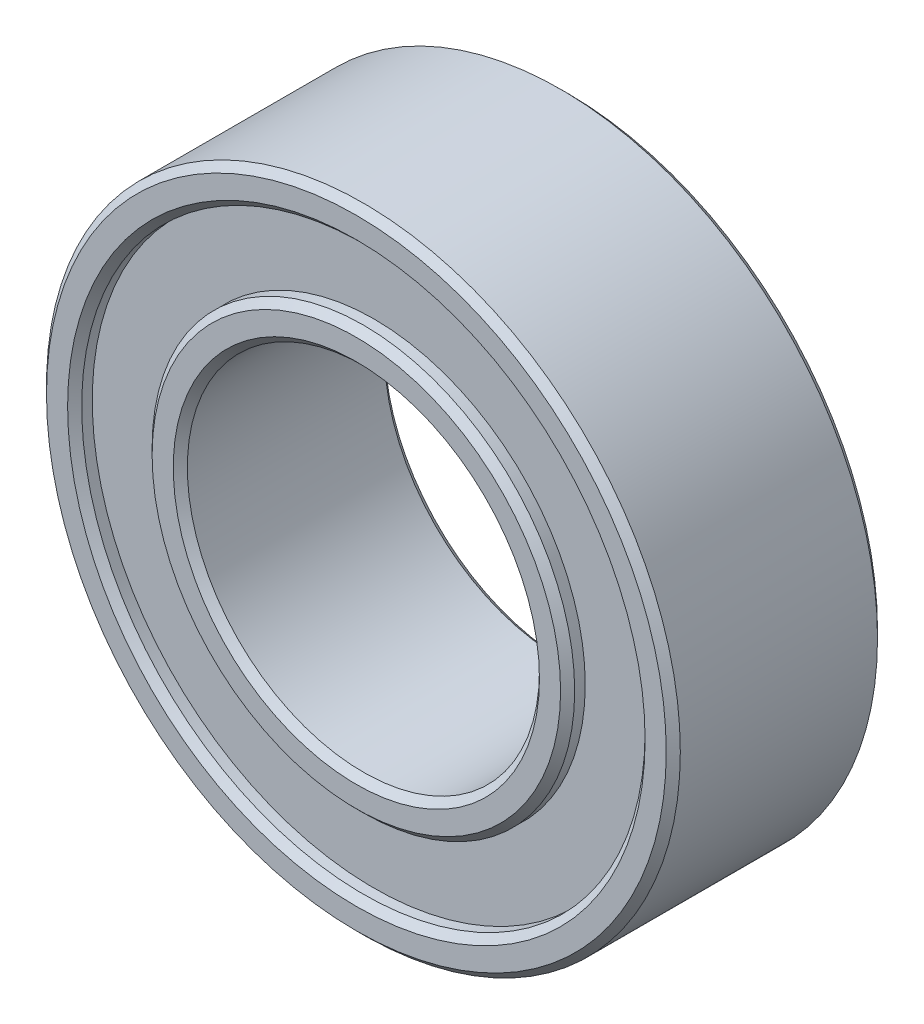
ISO-10303-21;
HEADER;
FILE_DESCRIPTION(('STEP AP214'),'2;1');
FILE_NAME('part.step','',(''),(''),'','','');
FILE_SCHEMA(('AUTOMOTIVE_DESIGN { 1 0 10303 214 1 1 1 1 }'));
ENDSEC;
DATA;
#1=APPLICATION_CONTEXT('core data for automotive mechanical design processes');
#2=APPLICATION_PROTOCOL_DEFINITION('international standard','automotive_design',2000,#1);
#3=PRODUCT_CONTEXT('',#1,'mechanical');
#4=PRODUCT('Part','Part','',(#3));
#5=PRODUCT_RELATED_PRODUCT_CATEGORY('part','',(#4));
#6=PRODUCT_DEFINITION_FORMATION('','',#4);
#7=PRODUCT_DEFINITION_CONTEXT('part definition',#1,'design');
#8=PRODUCT_DEFINITION('design','',#6,#7);
#9=PRODUCT_DEFINITION_SHAPE('','',#8);
#10=(LENGTH_UNIT() NAMED_UNIT(*) SI_UNIT(.MILLI.,.METRE.));
#11=(NAMED_UNIT(*) PLANE_ANGLE_UNIT() SI_UNIT($,.RADIAN.));
#12=(NAMED_UNIT(*) SI_UNIT($,.STERADIAN.) SOLID_ANGLE_UNIT());
#13=UNCERTAINTY_MEASURE_WITH_UNIT(LENGTH_MEASURE(1.E-05),#10,'distance_accuracy_value','');
#14=(GEOMETRIC_REPRESENTATION_CONTEXT(3) GLOBAL_UNCERTAINTY_ASSIGNED_CONTEXT((#13)) GLOBAL_UNIT_ASSIGNED_CONTEXT((#10,
#11,#12)) REPRESENTATION_CONTEXT('',''));
#15=CARTESIAN_POINT('',(0.,0.,0.));
#16=DIRECTION('',(0.,0.,1.));
#17=DIRECTION('',(1.,0.,0.));
#18=AXIS2_PLACEMENT_3D('',#15,#16,#17);
#19=CARTESIAN_POINT('',(0.,0.,0.100000000000003));
#20=DIRECTION('',(0.,0.,-1.));
#21=DIRECTION('',(-1.,0.,0.));
#22=AXIS2_PLACEMENT_3D('',#19,#20,#21);
#23=CONICAL_SURFACE('',#22,4.,0.785398163397457);
#24=CARTESIAN_POINT('',(0.,0.,0.100000000000003));
#25=DIRECTION('',(0.,0.,-1.));
#26=DIRECTION('',(-1.,0.,0.));
#27=AXIS2_PLACEMENT_3D('',#24,#25,#26);
#28=CIRCLE('',#27,4.);
#29=CARTESIAN_POINT('',(-4.,0.,0.100000000000003));
#30=VERTEX_POINT('',#29);
#31=EDGE_CURVE('E18',#30,#30,#28,.T.);
#32=ORIENTED_EDGE('',*,*,#31,.F.);
#33=EDGE_LOOP('',(#32));
#34=FACE_BOUND('',#33,.T.);
#35=CARTESIAN_POINT('',(0.,0.,0.));
#36=DIRECTION('',(0.,0.,1.));
#37=DIRECTION('',(1.,0.,0.));
#38=AXIS2_PLACEMENT_3D('',#35,#36,#37);
#39=CIRCLE('',#38,4.1);
#40=CARTESIAN_POINT('',(4.1,0.,0.));
#41=VERTEX_POINT('',#40);
#42=EDGE_CURVE('E48',#41,#41,#39,.T.);
#43=ORIENTED_EDGE('',*,*,#42,.F.);
#44=EDGE_LOOP('',(#43));
#45=FACE_BOUND('',#44,.T.);
#46=ADVANCED_FACE('F15',(#34,#45),#23,.F.);
#47=CARTESIAN_POINT('',(0.,0.,0.));
#48=DIRECTION('',(0.,0.,1.));
#49=DIRECTION('',(1.,0.,0.));
#50=AXIS2_PLACEMENT_3D('',#47,#48,#49);
#51=CONICAL_SURFACE('',#50,2.9,0.785398163397453);
#52=CARTESIAN_POINT('',(0.,0.,0.1));
#53=DIRECTION('',(0.,0.,1.));
#54=DIRECTION('',(1.,0.,0.));
#55=AXIS2_PLACEMENT_3D('',#52,#53,#54);
#56=CIRCLE('',#55,3.);
#57=CARTESIAN_POINT('',(3.,0.,0.1));
#58=VERTEX_POINT('',#57);
#59=EDGE_CURVE('E10',#58,#58,#56,.T.);
#60=ORIENTED_EDGE('',*,*,#59,.F.);
#61=EDGE_LOOP('',(#60));
#62=FACE_BOUND('',#61,.T.);
#63=CARTESIAN_POINT('',(0.,0.,0.));
#64=DIRECTION('',(0.,0.,-1.));
#65=DIRECTION('',(1.,0.,0.));
#66=AXIS2_PLACEMENT_3D('',#63,#64,#65);
#67=CIRCLE('',#66,2.9);
#68=CARTESIAN_POINT('',(2.9,0.,0.));
#69=VERTEX_POINT('',#68);
#70=EDGE_CURVE('E67',#69,#69,#67,.T.);
#71=ORIENTED_EDGE('',*,*,#70,.F.);
#72=EDGE_LOOP('',(#71));
#73=FACE_BOUND('',#72,.T.);
#74=ADVANCED_FACE('F134',(#62,#73),#51,.T.);
#75=CARTESIAN_POINT('',(0.,0.,0.));
#76=DIRECTION('',(0.,0.,-1.));
#77=DIRECTION('',(-1.,0.,0.));
#78=AXIS2_PLACEMENT_3D('',#75,#76,#77);
#79=CONICAL_SURFACE('',#78,2.6,0.785398163397451);
#80=CARTESIAN_POINT('',(0.,0.,0.1));
#81=DIRECTION('',(0.,0.,-1.));
#82=DIRECTION('',(1.,0.,0.));
#83=AXIS2_PLACEMENT_3D('',#80,#81,#82);
#84=CIRCLE('',#83,2.5);
#85=CARTESIAN_POINT('',(2.5,0.,0.1));
#86=VERTEX_POINT('',#85);
#87=EDGE_CURVE('E79',#86,#86,#84,.T.);
#88=ORIENTED_EDGE('',*,*,#87,.F.);
#89=EDGE_LOOP('',(#88));
#90=FACE_BOUND('',#89,.T.);
#91=CARTESIAN_POINT('',(0.,0.,0.));
#92=DIRECTION('',(0.,0.,1.));
#93=DIRECTION('',(1.,0.,0.));
#94=AXIS2_PLACEMENT_3D('',#91,#92,#93);
#95=CIRCLE('',#94,2.6);
#96=CARTESIAN_POINT('',(2.6,0.,0.));
#97=VERTEX_POINT('',#96);
#98=EDGE_CURVE('E65',#97,#97,#95,.T.);
#99=ORIENTED_EDGE('',*,*,#98,.F.);
#100=EDGE_LOOP('',(#99));
#101=FACE_BOUND('',#100,.T.);
#102=ADVANCED_FACE('F139',(#90,#101),#79,.F.);
#103=CARTESIAN_POINT('',(0.,0.,0.0999999999999985));
#104=DIRECTION('',(0.,0.,1.));
#105=DIRECTION('',(1.,0.,0.));
#106=AXIS2_PLACEMENT_3D('',#103,#104,#105);
#107=CONICAL_SURFACE('',#106,4.5,0.785398163397453);
#108=CARTESIAN_POINT('',(0.,0.,0.0999999999999985));
#109=DIRECTION('',(0.,0.,1.));
#110=DIRECTION('',(1.,0.,0.));
#111=AXIS2_PLACEMENT_3D('',#108,#109,#110);
#112=CIRCLE('',#111,4.5);
#113=CARTESIAN_POINT('',(4.5,0.,0.0999999999999985));
#114=VERTEX_POINT('',#113);
#115=EDGE_CURVE('E80',#114,#114,#112,.T.);
#116=ORIENTED_EDGE('',*,*,#115,.F.);
#117=EDGE_LOOP('',(#116));
#118=FACE_BOUND('',#117,.T.);
#119=CARTESIAN_POINT('',(0.,0.,0.));
#120=DIRECTION('',(0.,0.,-1.));
#121=DIRECTION('',(1.,0.,0.));
#122=AXIS2_PLACEMENT_3D('',#119,#120,#121);
#123=CIRCLE('',#122,4.4);
#124=CARTESIAN_POINT('',(4.4,0.,0.));
#125=VERTEX_POINT('',#124);
#126=EDGE_CURVE('E52',#125,#125,#123,.T.);
#127=ORIENTED_EDGE('',*,*,#126,.F.);
#128=EDGE_LOOP('',(#127));
#129=FACE_BOUND('',#128,.T.);
#130=ADVANCED_FACE('F111',(#118,#129),#107,.T.);
#131=CARTESIAN_POINT('',(0.,0.,2.9));
#132=DIRECTION('',(0.,0.,1.));
#133=DIRECTION('',(1.,0.,0.));
#134=AXIS2_PLACEMENT_3D('',#131,#132,#133);
#135=CONICAL_SURFACE('',#134,4.,0.785398163397461);
#136=CARTESIAN_POINT('',(0.,0.,2.9));
#137=DIRECTION('',(0.,0.,1.));
#138=DIRECTION('',(1.,0.,0.));
#139=AXIS2_PLACEMENT_3D('',#136,#137,#138);
#140=CIRCLE('',#139,4.);
#141=CARTESIAN_POINT('',(4.,0.,2.9));
#142=VERTEX_POINT('',#141);
#143=EDGE_CURVE('E90',#142,#142,#140,.T.);
#144=ORIENTED_EDGE('',*,*,#143,.F.);
#145=EDGE_LOOP('',(#144));
#146=FACE_BOUND('',#145,.T.);
#147=CARTESIAN_POINT('',(0.,0.,3.));
#148=DIRECTION('',(0.,0.,-1.));
#149=DIRECTION('',(1.,0.,0.));
#150=AXIS2_PLACEMENT_3D('',#147,#148,#149);
#151=CIRCLE('',#150,4.1);
#152=CARTESIAN_POINT('',(4.1,0.,3.));
#153=VERTEX_POINT('',#152);
#154=EDGE_CURVE('E56',#153,#153,#151,.T.);
#155=ORIENTED_EDGE('',*,*,#154,.F.);
#156=EDGE_LOOP('',(#155));
#157=FACE_BOUND('',#156,.T.);
#158=ADVANCED_FACE('F107',(#146,#157),#135,.F.);
#159=CARTESIAN_POINT('',(0.,0.,3.));
#160=DIRECTION('',(0.,0.,-1.));
#161=DIRECTION('',(-1.,0.,0.));
#162=AXIS2_PLACEMENT_3D('',#159,#160,#161);
#163=CONICAL_SURFACE('',#162,4.4,0.785398163397448);
#164=CARTESIAN_POINT('',(0.,0.,2.9));
#165=DIRECTION('',(0.,0.,-1.));
#166=DIRECTION('',(1.,0.,0.));
#167=AXIS2_PLACEMENT_3D('',#164,#165,#166);
#168=CIRCLE('',#167,4.5);
#169=CARTESIAN_POINT('',(4.5,0.,2.9));
#170=VERTEX_POINT('',#169);
#171=EDGE_CURVE('E71',#170,#170,#168,.T.);
#172=ORIENTED_EDGE('',*,*,#171,.F.);
#173=EDGE_LOOP('',(#172));
#174=FACE_BOUND('',#173,.T.);
#175=CARTESIAN_POINT('',(0.,0.,3.));
#176=DIRECTION('',(0.,0.,1.));
#177=DIRECTION('',(1.,0.,0.));
#178=AXIS2_PLACEMENT_3D('',#175,#176,#177);
#179=CIRCLE('',#178,4.4);
#180=CARTESIAN_POINT('',(4.4,0.,3.));
#181=VERTEX_POINT('',#180);
#182=EDGE_CURVE('E60',#181,#181,#179,.T.);
#183=ORIENTED_EDGE('',*,*,#182,.F.);
#184=EDGE_LOOP('',(#183));
#185=FACE_BOUND('',#184,.T.);
#186=ADVANCED_FACE('F110',(#174,#185),#163,.T.);
#187=CARTESIAN_POINT('',(0.,0.,3.));
#188=DIRECTION('',(0.,0.,-1.));
#189=DIRECTION('',(-1.,0.,0.));
#190=AXIS2_PLACEMENT_3D('',#187,#188,#189);
#191=CONICAL_SURFACE('',#190,2.9,0.785398163397453);
#192=CARTESIAN_POINT('',(0.,0.,2.9));
#193=DIRECTION('',(0.,0.,-1.));
#194=DIRECTION('',(1.,0.,0.));
#195=AXIS2_PLACEMENT_3D('',#192,#193,#194);
#196=CIRCLE('',#195,3.);
#197=CARTESIAN_POINT('',(3.,0.,2.9));
#198=VERTEX_POINT('',#197);
#199=EDGE_CURVE('E32',#198,#198,#196,.T.);
#200=ORIENTED_EDGE('',*,*,#199,.F.);
#201=EDGE_LOOP('',(#200));
#202=FACE_BOUND('',#201,.T.);
#203=CARTESIAN_POINT('',(0.,0.,3.));
#204=DIRECTION('',(0.,0.,1.));
#205=DIRECTION('',(1.,0.,0.));
#206=AXIS2_PLACEMENT_3D('',#203,#204,#205);
#207=CIRCLE('',#206,2.9);
#208=CARTESIAN_POINT('',(2.9,0.,3.));
#209=VERTEX_POINT('',#208);
#210=EDGE_CURVE('E61',#209,#209,#207,.T.);
#211=ORIENTED_EDGE('',*,*,#210,.F.);
#212=EDGE_LOOP('',(#211));
#213=FACE_BOUND('',#212,.T.);
#214=ADVANCED_FACE('F303',(#202,#213),#191,.T.);
#215=CARTESIAN_POINT('',(0.,0.,2.9));
#216=DIRECTION('',(0.,0.,1.));
#217=DIRECTION('',(1.,0.,0.));
#218=AXIS2_PLACEMENT_3D('',#215,#216,#217);
#219=CONICAL_SURFACE('',#218,2.5,0.785398163397451);
#220=CARTESIAN_POINT('',(0.,0.,2.9));
#221=DIRECTION('',(0.,0.,1.));
#222=DIRECTION('',(1.,0.,0.));
#223=AXIS2_PLACEMENT_3D('',#220,#221,#222);
#224=CIRCLE('',#223,2.5);
#225=CARTESIAN_POINT('',(2.5,0.,2.9));
#226=VERTEX_POINT('',#225);
#227=EDGE_CURVE('E75',#226,#226,#224,.T.);
#228=ORIENTED_EDGE('',*,*,#227,.F.);
#229=EDGE_LOOP('',(#228));
#230=FACE_BOUND('',#229,.T.);
#231=CARTESIAN_POINT('',(0.,0.,3.));
#232=DIRECTION('',(0.,0.,-1.));
#233=DIRECTION('',(1.,0.,0.));
#234=AXIS2_PLACEMENT_3D('',#231,#232,#233);
#235=CIRCLE('',#234,2.6);
#236=CARTESIAN_POINT('',(2.6,0.,3.));
#237=VERTEX_POINT('',#236);
#238=EDGE_CURVE('E66',#237,#237,#235,.T.);
#239=ORIENTED_EDGE('',*,*,#238,.F.);
#240=EDGE_LOOP('',(#239));
#241=FACE_BOUND('',#240,.T.);
#242=ADVANCED_FACE('F158',(#230,#241),#219,.F.);
#243=CARTESIAN_POINT('',(0.,0.,2.75));
#244=DIRECTION('',(0.,0.,1.));
#245=DIRECTION('',(1.,0.,0.));
#246=AXIS2_PLACEMENT_3D('',#243,#244,#245);
#247=CYLINDRICAL_SURFACE('',#246,3.);
#248=ORIENTED_EDGE('',*,*,#59,.T.);
#249=EDGE_LOOP('',(#248));
#250=FACE_BOUND('',#249,.T.);
#251=CARTESIAN_POINT('',(0.,0.,0.25));
#252=DIRECTION('',(0.,0.,-1.));
#253=DIRECTION('',(-1.,0.,0.));
#254=AXIS2_PLACEMENT_3D('',#251,#252,#253);
#255=CIRCLE('',#254,3.);
#256=CARTESIAN_POINT('',(-3.,0.,0.25));
#257=VERTEX_POINT('',#256);
#258=EDGE_CURVE('E35',#257,#257,#255,.T.);
#259=ORIENTED_EDGE('',*,*,#258,.T.);
#260=EDGE_LOOP('',(#259));
#261=FACE_BOUND('',#260,.T.);
#262=ADVANCED_FACE('F149',(#250,#261),#247,.T.);
#263=CARTESIAN_POINT('',(0.,0.,2.75));
#264=DIRECTION('',(0.,0.,1.));
#265=DIRECTION('',(1.,0.,0.));
#266=AXIS2_PLACEMENT_3D('',#263,#264,#265);
#267=CYLINDRICAL_SURFACE('',#266,4.);
#268=CARTESIAN_POINT('',(0.,0.,0.25));
#269=DIRECTION('',(0.,0.,-1.));
#270=DIRECTION('',(-1.,0.,0.));
#271=AXIS2_PLACEMENT_3D('',#268,#269,#270);
#272=CIRCLE('',#271,4.);
#273=CARTESIAN_POINT('',(-4.,0.,0.25));
#274=VERTEX_POINT('',#273);
#275=EDGE_CURVE('E36',#274,#274,#272,.T.);
#276=ORIENTED_EDGE('',*,*,#275,.F.);
#277=EDGE_LOOP('',(#276));
#278=FACE_BOUND('',#277,.T.);
#279=ORIENTED_EDGE('',*,*,#31,.T.);
#280=EDGE_LOOP('',(#279));
#281=FACE_BOUND('',#280,.T.);
#282=ADVANCED_FACE('F146',(#278,#281),#267,.F.);
#283=CARTESIAN_POINT('',(0.,0.,2.75));
#284=DIRECTION('',(0.,0.,1.));
#285=DIRECTION('',(1.,0.,0.));
#286=AXIS2_PLACEMENT_3D('',#283,#284,#285);
#287=CYLINDRICAL_SURFACE('',#286,3.);
#288=ORIENTED_EDGE('',*,*,#199,.T.);
#289=EDGE_LOOP('',(#288));
#290=FACE_BOUND('',#289,.T.);
#291=CARTESIAN_POINT('',(0.,0.,2.75));
#292=DIRECTION('',(0.,0.,1.));
#293=DIRECTION('',(1.,0.,0.));
#294=AXIS2_PLACEMENT_3D('',#291,#292,#293);
#295=CIRCLE('',#294,3.);
#296=CARTESIAN_POINT('',(3.,0.,2.75));
#297=VERTEX_POINT('',#296);
#298=EDGE_CURVE('E40',#297,#297,#295,.T.);
#299=ORIENTED_EDGE('',*,*,#298,.T.);
#300=EDGE_LOOP('',(#299));
#301=FACE_BOUND('',#300,.T.);
#302=ADVANCED_FACE('F148',(#290,#301),#287,.T.);
#303=CARTESIAN_POINT('',(0.,0.,2.75));
#304=DIRECTION('',(0.,0.,1.));
#305=DIRECTION('',(1.,0.,0.));
#306=AXIS2_PLACEMENT_3D('',#303,#304,#305);
#307=CYLINDRICAL_SURFACE('',#306,4.);
#308=CARTESIAN_POINT('',(0.,0.,2.75));
#309=DIRECTION('',(0.,0.,1.));
#310=DIRECTION('',(1.,0.,0.));
#311=AXIS2_PLACEMENT_3D('',#308,#309,#310);
#312=CIRCLE('',#311,4.);
#313=CARTESIAN_POINT('',(4.,0.,2.75));
#314=VERTEX_POINT('',#313);
#315=EDGE_CURVE('E44',#314,#314,#312,.T.);
#316=ORIENTED_EDGE('',*,*,#315,.F.);
#317=EDGE_LOOP('',(#316));
#318=FACE_BOUND('',#317,.T.);
#319=ORIENTED_EDGE('',*,*,#143,.T.);
#320=EDGE_LOOP('',(#319));
#321=FACE_BOUND('',#320,.T.);
#322=ADVANCED_FACE('F105',(#318,#321),#307,.F.);
#323=CARTESIAN_POINT('',(0.,0.,0.));
#324=DIRECTION('',(0.,0.,1.));
#325=DIRECTION('',(1.,0.,0.));
#326=AXIS2_PLACEMENT_3D('',#323,#324,#325);
#327=CYLINDRICAL_SURFACE('',#326,2.5);
#328=ORIENTED_EDGE('',*,*,#87,.T.);
#329=EDGE_LOOP('',(#328));
#330=FACE_BOUND('',#329,.T.);
#331=ORIENTED_EDGE('',*,*,#227,.T.);
#332=EDGE_LOOP('',(#331));
#333=FACE_BOUND('',#332,.T.);
#334=ADVANCED_FACE('F293',(#330,#333),#327,.F.);
#335=CARTESIAN_POINT('',(0.,0.,3.));
#336=DIRECTION('',(0.,0.,-1.));
#337=DIRECTION('',(-1.,0.,0.));
#338=AXIS2_PLACEMENT_3D('',#335,#336,#337);
#339=CYLINDRICAL_SURFACE('',#338,4.5);
#340=ORIENTED_EDGE('',*,*,#115,.T.);
#341=EDGE_LOOP('',(#340));
#342=FACE_BOUND('',#341,.T.);
#343=ORIENTED_EDGE('',*,*,#171,.T.);
#344=EDGE_LOOP('',(#343));
#345=FACE_BOUND('',#344,.T.);
#346=ADVANCED_FACE('F284',(#342,#345),#339,.T.);
#347=CARTESIAN_POINT('',(0.,0.,0.));
#348=DIRECTION('',(0.,0.,1.));
#349=DIRECTION('',(1.,0.,0.));
#350=AXIS2_PLACEMENT_3D('',#347,#348,#349);
#351=PLANE('',#350);
#352=ORIENTED_EDGE('',*,*,#70,.T.);
#353=EDGE_LOOP('',(#352));
#354=FACE_BOUND('',#353,.T.);
#355=ORIENTED_EDGE('',*,*,#98,.T.);
#356=EDGE_LOOP('',(#355));
#357=FACE_BOUND('',#356,.T.);
#358=ADVANCED_FACE('F129',(#354,#357),#351,.F.);
#359=CARTESIAN_POINT('',(0.,0.,3.));
#360=DIRECTION('',(0.,0.,1.));
#361=DIRECTION('',(1.,0.,0.));
#362=AXIS2_PLACEMENT_3D('',#359,#360,#361);
#363=PLANE('',#362);
#364=ORIENTED_EDGE('',*,*,#210,.T.);
#365=EDGE_LOOP('',(#364));
#366=FACE_BOUND('',#365,.T.);
#367=ORIENTED_EDGE('',*,*,#238,.T.);
#368=EDGE_LOOP('',(#367));
#369=FACE_BOUND('',#368,.T.);
#370=ADVANCED_FACE('F118',(#366,#369),#363,.T.);
#371=CARTESIAN_POINT('',(0.,0.,3.));
#372=DIRECTION('',(0.,0.,1.));
#373=DIRECTION('',(1.,0.,0.));
#374=AXIS2_PLACEMENT_3D('',#371,#372,#373);
#375=PLANE('',#374);
#376=ORIENTED_EDGE('',*,*,#182,.T.);
#377=EDGE_LOOP('',(#376));
#378=FACE_BOUND('',#377,.T.);
#379=ORIENTED_EDGE('',*,*,#154,.T.);
#380=EDGE_LOOP('',(#379));
#381=FACE_BOUND('',#380,.T.);
#382=ADVANCED_FACE('F115',(#378,#381),#375,.T.);
#383=CARTESIAN_POINT('',(0.,0.,0.));
#384=DIRECTION('',(0.,0.,1.));
#385=DIRECTION('',(1.,0.,0.));
#386=AXIS2_PLACEMENT_3D('',#383,#384,#385);
#387=PLANE('',#386);
#388=ORIENTED_EDGE('',*,*,#126,.T.);
#389=EDGE_LOOP('',(#388));
#390=FACE_BOUND('',#389,.T.);
#391=ORIENTED_EDGE('',*,*,#42,.T.);
#392=EDGE_LOOP('',(#391));
#393=FACE_BOUND('',#392,.T.);
#394=ADVANCED_FACE('F117',(#390,#393),#387,.F.);
#395=CARTESIAN_POINT('',(0.,0.,2.75));
#396=DIRECTION('',(0.,0.,1.));
#397=DIRECTION('',(1.,0.,0.));
#398=AXIS2_PLACEMENT_3D('',#395,#396,#397);
#399=PLANE('',#398);
#400=ORIENTED_EDGE('',*,*,#315,.T.);
#401=EDGE_LOOP('',(#400));
#402=FACE_BOUND('',#401,.T.);
#403=ORIENTED_EDGE('',*,*,#298,.F.);
#404=EDGE_LOOP('',(#403));
#405=FACE_BOUND('',#404,.T.);
#406=ADVANCED_FACE('F126',(#402,#405),#399,.T.);
#407=CARTESIAN_POINT('',(0.,0.,0.25));
#408=DIRECTION('',(0.,0.,-1.));
#409=DIRECTION('',(0.,-1.,0.));
#410=AXIS2_PLACEMENT_3D('',#407,#408,#409);
#411=PLANE('',#410);
#412=ORIENTED_EDGE('',*,*,#275,.T.);
#413=EDGE_LOOP('',(#412));
#414=FACE_BOUND('',#413,.T.);
#415=ORIENTED_EDGE('',*,*,#258,.F.);
#416=EDGE_LOOP('',(#415));
#417=FACE_BOUND('',#416,.T.);
#418=ADVANCED_FACE('F163',(#414,#417),#411,.T.);
#419=CLOSED_SHELL('',(#46,#74,#102,#130,#158,#186,#214,#242,#262,#282,#302,#322,#334,#346,#358,
#370,#382,#394,#406,#418));
#420=MANIFOLD_SOLID_BREP('B1',#419);
#421=ADVANCED_BREP_SHAPE_REPRESENTATION('',(#18,#420),#14);
#422=SHAPE_DEFINITION_REPRESENTATION(#9,#421);
ENDSEC;
END-ISO-10303-21;
